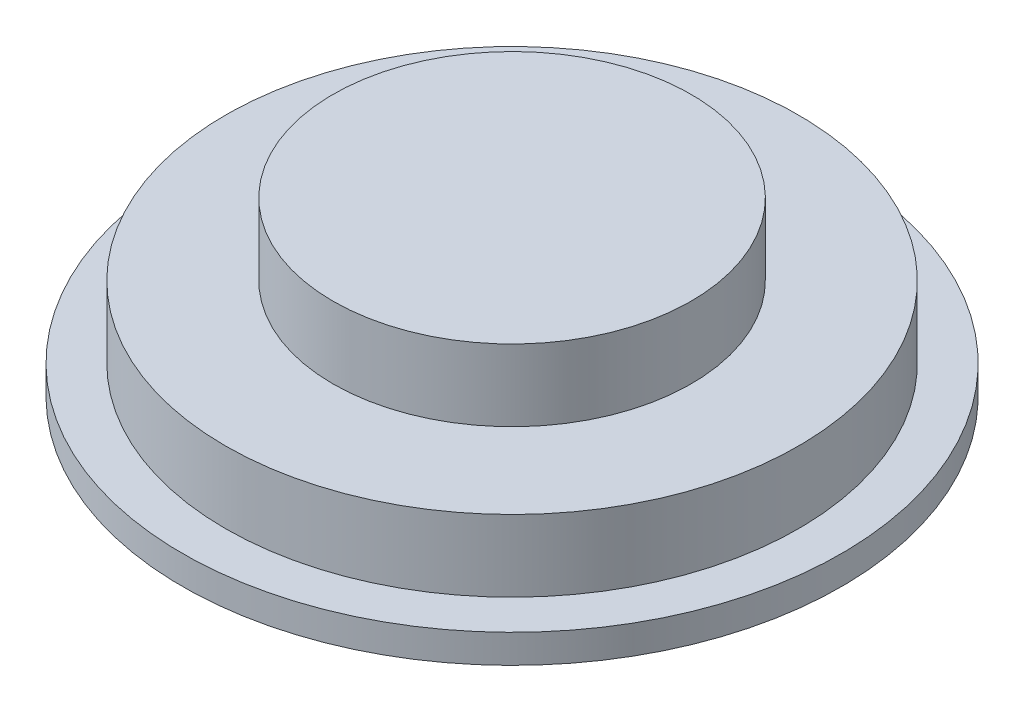
ISO-10303-21;
HEADER;
FILE_DESCRIPTION(('STEP AP214'),'2;1');
FILE_NAME('part.step','',(''),(''),'','','');
FILE_SCHEMA(('AUTOMOTIVE_DESIGN { 1 0 10303 214 1 1 1 1 }'));
ENDSEC;
DATA;
#1=APPLICATION_CONTEXT('core data for automotive mechanical design processes');
#2=APPLICATION_PROTOCOL_DEFINITION('international standard','automotive_design',2000,#1);
#3=PRODUCT_CONTEXT('',#1,'mechanical');
#4=PRODUCT('Part','Part','',(#3));
#5=PRODUCT_RELATED_PRODUCT_CATEGORY('part','',(#4));
#6=PRODUCT_DEFINITION_FORMATION('','',#4);
#7=PRODUCT_DEFINITION_CONTEXT('part definition',#1,'design');
#8=PRODUCT_DEFINITION('design','',#6,#7);
#9=PRODUCT_DEFINITION_SHAPE('','',#8);
#10=(LENGTH_UNIT() NAMED_UNIT(*) SI_UNIT(.MILLI.,.METRE.));
#11=(NAMED_UNIT(*) PLANE_ANGLE_UNIT() SI_UNIT($,.RADIAN.));
#12=(NAMED_UNIT(*) SI_UNIT($,.STERADIAN.) SOLID_ANGLE_UNIT());
#13=UNCERTAINTY_MEASURE_WITH_UNIT(LENGTH_MEASURE(1.E-05),#10,'distance_accuracy_value','');
#14=(GEOMETRIC_REPRESENTATION_CONTEXT(3) GLOBAL_UNCERTAINTY_ASSIGNED_CONTEXT((#13)) GLOBAL_UNIT_ASSIGNED_CONTEXT((#10,
#11,#12)) REPRESENTATION_CONTEXT('',''));
#15=CARTESIAN_POINT('',(0.,0.,0.));
#16=DIRECTION('',(0.,0.,1.));
#17=DIRECTION('',(1.,0.,0.));
#18=AXIS2_PLACEMENT_3D('',#15,#16,#17);
#19=CARTESIAN_POINT('',(0.,5.,0.));
#20=DIRECTION('',(0.,-1.,0.));
#21=DIRECTION('',(0.,0.,-1.));
#22=AXIS2_PLACEMENT_3D('',#19,#20,#21);
#23=CYLINDRICAL_SURFACE('',#22,20.);
#24=CARTESIAN_POINT('',(0.,5.,0.));
#25=DIRECTION('',(0.,1.,0.));
#26=DIRECTION('',(0.,0.,1.));
#27=AXIS2_PLACEMENT_3D('',#24,#25,#26);
#28=CIRCLE('',#27,20.);
#29=CARTESIAN_POINT('',(0.,5.,20.));
#30=VERTEX_POINT('',#29);
#31=EDGE_CURVE('E40',#30,#30,#28,.T.);
#32=ORIENTED_EDGE('',*,*,#31,.F.);
#33=EDGE_LOOP('',(#32));
#34=FACE_BOUND('',#33,.T.);
#35=CARTESIAN_POINT('',(0.,0.,0.));
#36=DIRECTION('',(0.,1.,0.));
#37=DIRECTION('',(0.,0.,1.));
#38=AXIS2_PLACEMENT_3D('',#35,#36,#37);
#39=CIRCLE('',#38,20.);
#40=CARTESIAN_POINT('',(0.,0.,20.));
#41=VERTEX_POINT('',#40);
#42=EDGE_CURVE('E36',#41,#41,#39,.T.);
#43=ORIENTED_EDGE('',*,*,#42,.T.);
#44=EDGE_LOOP('',(#43));
#45=FACE_BOUND('',#44,.T.);
#46=ADVANCED_FACE('F33',(#34,#45),#23,.T.);
#47=CARTESIAN_POINT('',(0.,5.,0.));
#48=DIRECTION('',(0.,1.,0.));
#49=DIRECTION('',(0.,0.,1.));
#50=AXIS2_PLACEMENT_3D('',#47,#48,#49);
#51=PLANE('',#50);
#52=CARTESIAN_POINT('',(0.,5.,0.));
#53=DIRECTION('',(0.,1.,0.));
#54=DIRECTION('',(0.,0.,1.));
#55=AXIS2_PLACEMENT_3D('',#52,#53,#54);
#56=CIRCLE('',#55,12.5);
#57=CARTESIAN_POINT('',(0.,5.,12.5));
#58=VERTEX_POINT('',#57);
#59=EDGE_CURVE('E10',#58,#58,#56,.T.);
#60=ORIENTED_EDGE('',*,*,#59,.F.);
#61=EDGE_LOOP('',(#60));
#62=FACE_BOUND('',#61,.T.);
#63=ORIENTED_EDGE('',*,*,#31,.T.);
#64=EDGE_LOOP('',(#63));
#65=FACE_BOUND('',#64,.T.);
#66=ADVANCED_FACE('F74',(#62,#65),#51,.T.);
#67=CARTESIAN_POINT('',(0.,-2.,0.));
#68=DIRECTION('',(0.,1.,0.));
#69=DIRECTION('',(0.,0.,1.));
#70=AXIS2_PLACEMENT_3D('',#67,#68,#69);
#71=CYLINDRICAL_SURFACE('',#70,23.);
#72=CARTESIAN_POINT('',(0.,-2.,0.));
#73=DIRECTION('',(0.,-1.,0.));
#74=DIRECTION('',(0.,0.,-1.));
#75=AXIS2_PLACEMENT_3D('',#72,#73,#74);
#76=CIRCLE('',#75,23.);
#77=CARTESIAN_POINT('',(0.,-2.,-23.));
#78=VERTEX_POINT('',#77);
#79=EDGE_CURVE('E48',#78,#78,#76,.T.);
#80=ORIENTED_EDGE('',*,*,#79,.F.);
#81=EDGE_LOOP('',(#80));
#82=FACE_BOUND('',#81,.T.);
#83=CARTESIAN_POINT('',(0.,0.,0.));
#84=DIRECTION('',(0.,-1.,0.));
#85=DIRECTION('',(0.,0.,-1.));
#86=AXIS2_PLACEMENT_3D('',#83,#84,#85);
#87=CIRCLE('',#86,23.);
#88=CARTESIAN_POINT('',(0.,0.,-23.));
#89=VERTEX_POINT('',#88);
#90=EDGE_CURVE('E51',#89,#89,#87,.T.);
#91=ORIENTED_EDGE('',*,*,#90,.T.);
#92=EDGE_LOOP('',(#91));
#93=FACE_BOUND('',#92,.T.);
#94=ADVANCED_FACE('F79',(#82,#93),#71,.T.);
#95=CARTESIAN_POINT('',(0.,-2.,0.));
#96=DIRECTION('',(0.,-1.,0.));
#97=DIRECTION('',(0.,0.,-1.));
#98=AXIS2_PLACEMENT_3D('',#95,#96,#97);
#99=PLANE('',#98);
#100=ORIENTED_EDGE('',*,*,#79,.T.);
#101=EDGE_LOOP('',(#100));
#102=FACE_BOUND('',#101,.T.);
#103=ADVANCED_FACE('F69',(#102),#99,.T.);
#104=CARTESIAN_POINT('',(0.,0.,0.));
#105=DIRECTION('',(0.,-1.,0.));
#106=DIRECTION('',(0.,0.,-1.));
#107=AXIS2_PLACEMENT_3D('',#104,#105,#106);
#108=PLANE('',#107);
#109=ORIENTED_EDGE('',*,*,#42,.F.);
#110=EDGE_LOOP('',(#109));
#111=FACE_BOUND('',#110,.T.);
#112=ORIENTED_EDGE('',*,*,#90,.F.);
#113=EDGE_LOOP('',(#112));
#114=FACE_BOUND('',#113,.T.);
#115=ADVANCED_FACE('F62',(#111,#114),#108,.F.);
#116=CARTESIAN_POINT('',(0.,10.,0.));
#117=DIRECTION('',(0.,-1.,0.));
#118=DIRECTION('',(0.,0.,-1.));
#119=AXIS2_PLACEMENT_3D('',#116,#117,#118);
#120=CYLINDRICAL_SURFACE('',#119,12.5);
#121=CARTESIAN_POINT('',(0.,10.,0.));
#122=DIRECTION('',(0.,1.,0.));
#123=DIRECTION('',(0.,0.,1.));
#124=AXIS2_PLACEMENT_3D('',#121,#122,#123);
#125=CIRCLE('',#124,12.5);
#126=CARTESIAN_POINT('',(0.,10.,12.5));
#127=VERTEX_POINT('',#126);
#128=EDGE_CURVE('E47',#127,#127,#125,.T.);
#129=ORIENTED_EDGE('',*,*,#128,.F.);
#130=EDGE_LOOP('',(#129));
#131=FACE_BOUND('',#130,.T.);
#132=ORIENTED_EDGE('',*,*,#59,.T.);
#133=EDGE_LOOP('',(#132));
#134=FACE_BOUND('',#133,.T.);
#135=ADVANCED_FACE('F60',(#131,#134),#120,.T.);
#136=CARTESIAN_POINT('',(0.,10.,0.));
#137=DIRECTION('',(0.,1.,0.));
#138=DIRECTION('',(0.,0.,1.));
#139=AXIS2_PLACEMENT_3D('',#136,#137,#138);
#140=PLANE('',#139);
#141=ORIENTED_EDGE('',*,*,#128,.T.);
#142=EDGE_LOOP('',(#141));
#143=FACE_BOUND('',#142,.T.);
#144=ADVANCED_FACE('F58',(#143),#140,.T.);
#145=CLOSED_SHELL('',(#46,#66,#94,#103,#115,#135,#144));
#146=MANIFOLD_SOLID_BREP('B2',#145);
#147=ADVANCED_BREP_SHAPE_REPRESENTATION('',(#18,#146),#14);
#148=SHAPE_DEFINITION_REPRESENTATION(#9,#147);
ENDSEC;
END-ISO-10303-21;
